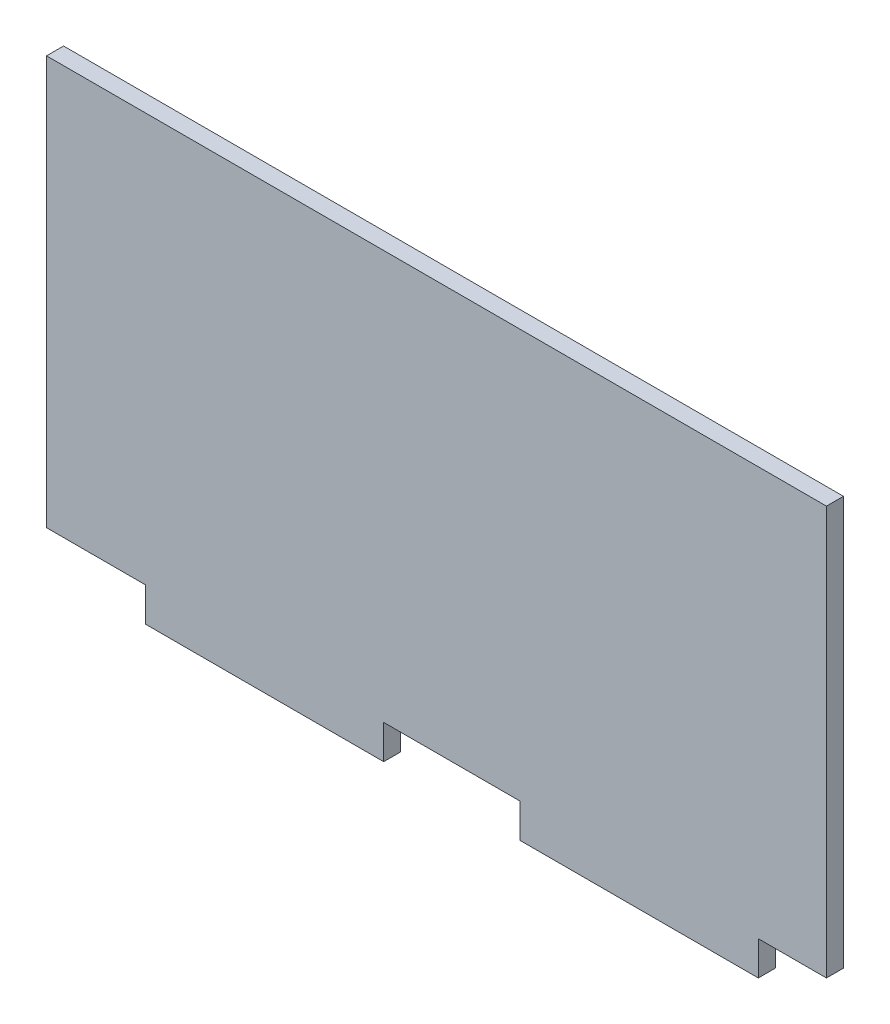
ISO-10303-21;
HEADER;
FILE_DESCRIPTION(('STEP AP214'),'2;1');
FILE_NAME('part.step','',(''),(''),'','','');
FILE_SCHEMA(('AUTOMOTIVE_DESIGN { 1 0 10303 214 1 1 1 1 }'));
ENDSEC;
DATA;
#1=APPLICATION_CONTEXT('core data for automotive mechanical design processes');
#2=APPLICATION_PROTOCOL_DEFINITION('international standard','automotive_design',2000,#1);
#3=PRODUCT_CONTEXT('',#1,'mechanical');
#4=PRODUCT('Part','Part','',(#3));
#5=PRODUCT_RELATED_PRODUCT_CATEGORY('part','',(#4));
#6=PRODUCT_DEFINITION_FORMATION('','',#4);
#7=PRODUCT_DEFINITION_CONTEXT('part definition',#1,'design');
#8=PRODUCT_DEFINITION('design','',#6,#7);
#9=PRODUCT_DEFINITION_SHAPE('','',#8);
#10=(LENGTH_UNIT() NAMED_UNIT(*) SI_UNIT(.MILLI.,.METRE.));
#11=(NAMED_UNIT(*) PLANE_ANGLE_UNIT() SI_UNIT($,.RADIAN.));
#12=(NAMED_UNIT(*) SI_UNIT($,.STERADIAN.) SOLID_ANGLE_UNIT());
#13=UNCERTAINTY_MEASURE_WITH_UNIT(LENGTH_MEASURE(1.E-05),#10,'distance_accuracy_value','');
#14=(GEOMETRIC_REPRESENTATION_CONTEXT(3) GLOBAL_UNCERTAINTY_ASSIGNED_CONTEXT((#13)) GLOBAL_UNIT_ASSIGNED_CONTEXT((#10,
#11,#12)) REPRESENTATION_CONTEXT('',''));
#15=CARTESIAN_POINT('',(0.,0.,0.));
#16=DIRECTION('',(0.,0.,1.));
#17=DIRECTION('',(1.,0.,0.));
#18=AXIS2_PLACEMENT_3D('',#15,#16,#17);
#19=CARTESIAN_POINT('',(144.376012965964,120.,5.));
#20=DIRECTION('',(0.,-1.,0.));
#21=DIRECTION('',(1.,0.,0.));
#22=AXIS2_PLACEMENT_3D('',#19,#20,#21);
#23=PLANE('',#22);
#24=DIRECTION('',(-1.,0.,0.));
#25=VECTOR('',#24,1.);
#26=CARTESIAN_POINT('',(144.376012965964,120.,0.));
#27=LINE('',#26,#25);
#28=CARTESIAN_POINT('',(144.376012965964,120.,0.));
#29=VERTEX_POINT('',#28);
#30=CARTESIAN_POINT('',(-84.6239870340357,120.,0.));
#31=VERTEX_POINT('',#30);
#32=EDGE_CURVE('E160',#29,#31,#27,.T.);
#33=ORIENTED_EDGE('',*,*,#32,.T.);
#34=DIRECTION('',(0.,0.,-1.));
#35=VECTOR('',#34,1.);
#36=CARTESIAN_POINT('',(-84.6239870340357,120.,5.));
#37=LINE('',#36,#35);
#38=CARTESIAN_POINT('',(-84.6239870340357,120.,5.));
#39=VERTEX_POINT('',#38);
#40=EDGE_CURVE('E11',#39,#31,#37,.T.);
#41=ORIENTED_EDGE('',*,*,#40,.F.);
#42=DIRECTION('',(-1.,0.,0.));
#43=VECTOR('',#42,1.);
#44=CARTESIAN_POINT('',(144.376012965964,120.,5.));
#45=LINE('',#44,#43);
#46=CARTESIAN_POINT('',(144.376012965964,120.,5.));
#47=VERTEX_POINT('',#46);
#48=EDGE_CURVE('E182',#47,#39,#45,.T.);
#49=ORIENTED_EDGE('',*,*,#48,.F.);
#50=DIRECTION('',(0.,0.,-1.));
#51=VECTOR('',#50,1.);
#52=CARTESIAN_POINT('',(144.376012965964,120.,5.));
#53=LINE('',#52,#51);
#54=EDGE_CURVE('E156',#47,#29,#53,.T.);
#55=ORIENTED_EDGE('',*,*,#54,.T.);
#56=EDGE_LOOP('',(#33,#41,#49,#55));
#57=FACE_BOUND('',#56,.T.);
#58=ADVANCED_FACE('F40',(#57),#23,.F.);
#59=CARTESIAN_POINT('',(-84.6239870340357,120.,5.));
#60=DIRECTION('',(1.,0.,0.));
#61=DIRECTION('',(0.,1.,0.));
#62=AXIS2_PLACEMENT_3D('',#59,#60,#61);
#63=PLANE('',#62);
#64=DIRECTION('',(0.,-1.,0.));
#65=VECTOR('',#64,1.);
#66=CARTESIAN_POINT('',(-84.6239870340357,120.,0.));
#67=LINE('',#66,#65);
#68=CARTESIAN_POINT('',(-84.6239870340357,0.,0.));
#69=VERTEX_POINT('',#68);
#70=EDGE_CURVE('E163',#31,#69,#67,.T.);
#71=ORIENTED_EDGE('',*,*,#70,.T.);
#72=DIRECTION('',(0.,0.,-1.));
#73=VECTOR('',#72,1.);
#74=CARTESIAN_POINT('',(-84.6239870340357,0.,5.));
#75=LINE('',#74,#73);
#76=CARTESIAN_POINT('',(-84.6239870340357,0.,5.));
#77=VERTEX_POINT('',#76);
#78=EDGE_CURVE('E48',#77,#69,#75,.T.);
#79=ORIENTED_EDGE('',*,*,#78,.F.);
#80=DIRECTION('',(0.,-1.,0.));
#81=VECTOR('',#80,1.);
#82=CARTESIAN_POINT('',(-84.6239870340357,120.,5.));
#83=LINE('',#82,#81);
#84=EDGE_CURVE('E111',#39,#77,#83,.T.);
#85=ORIENTED_EDGE('',*,*,#84,.F.);
#86=ORIENTED_EDGE('',*,*,#40,.T.);
#87=EDGE_LOOP('',(#71,#79,#85,#86));
#88=FACE_BOUND('',#87,.T.);
#89=ADVANCED_FACE('F260',(#88),#63,.F.);
#90=CARTESIAN_POINT('',(-84.6239870340357,0.,5.));
#91=DIRECTION('',(0.,1.,0.));
#92=DIRECTION('',(0.,0.,1.));
#93=AXIS2_PLACEMENT_3D('',#90,#91,#92);
#94=PLANE('',#93);
#95=DIRECTION('',(1.,0.,0.));
#96=VECTOR('',#95,1.);
#97=CARTESIAN_POINT('',(-84.6239870340357,0.,0.));
#98=LINE('',#97,#96);
#99=CARTESIAN_POINT('',(-55.6239870340357,0.,0.));
#100=VERTEX_POINT('',#99);
#101=EDGE_CURVE('E165',#69,#100,#98,.T.);
#102=ORIENTED_EDGE('',*,*,#101,.T.);
#103=DIRECTION('',(0.,0.,-1.));
#104=VECTOR('',#103,1.);
#105=CARTESIAN_POINT('',(-55.6239870340357,0.,5.));
#106=LINE('',#105,#104);
#107=CARTESIAN_POINT('',(-55.6239870340357,0.,5.));
#108=VERTEX_POINT('',#107);
#109=EDGE_CURVE('E201',#108,#100,#106,.T.);
#110=ORIENTED_EDGE('',*,*,#109,.F.);
#111=DIRECTION('',(1.,0.,0.));
#112=VECTOR('',#111,1.);
#113=CARTESIAN_POINT('',(-84.6239870340357,0.,5.));
#114=LINE('',#113,#112);
#115=EDGE_CURVE('E209',#77,#108,#114,.T.);
#116=ORIENTED_EDGE('',*,*,#115,.F.);
#117=ORIENTED_EDGE('',*,*,#78,.T.);
#118=EDGE_LOOP('',(#102,#110,#116,#117));
#119=FACE_BOUND('',#118,.T.);
#120=ADVANCED_FACE('F207',(#119),#94,.F.);
#121=CARTESIAN_POINT('',(-55.6239870340357,0.,5.));
#122=DIRECTION('',(1.,0.,0.));
#123=DIRECTION('',(0.,0.,-1.));
#124=AXIS2_PLACEMENT_3D('',#121,#122,#123);
#125=PLANE('',#124);
#126=DIRECTION('',(0.,-1.,0.));
#127=VECTOR('',#126,1.);
#128=CARTESIAN_POINT('',(-55.6239870340357,0.,0.));
#129=LINE('',#128,#127);
#130=CARTESIAN_POINT('',(-55.6239870340357,-10.,0.));
#131=VERTEX_POINT('',#130);
#132=EDGE_CURVE('E167',#100,#131,#129,.T.);
#133=ORIENTED_EDGE('',*,*,#132,.T.);
#134=DIRECTION('',(0.,0.,-1.));
#135=VECTOR('',#134,1.);
#136=CARTESIAN_POINT('',(-55.6239870340357,-10.,5.));
#137=LINE('',#136,#135);
#138=CARTESIAN_POINT('',(-55.6239870340357,-10.,5.));
#139=VERTEX_POINT('',#138);
#140=EDGE_CURVE('E198',#139,#131,#137,.T.);
#141=ORIENTED_EDGE('',*,*,#140,.F.);
#142=DIRECTION('',(0.,-1.,0.));
#143=VECTOR('',#142,1.);
#144=CARTESIAN_POINT('',(-55.6239870340357,0.,5.));
#145=LINE('',#144,#143);
#146=EDGE_CURVE('E227',#108,#139,#145,.T.);
#147=ORIENTED_EDGE('',*,*,#146,.F.);
#148=ORIENTED_EDGE('',*,*,#109,.T.);
#149=EDGE_LOOP('',(#133,#141,#147,#148));
#150=FACE_BOUND('',#149,.T.);
#151=ADVANCED_FACE('F218',(#150),#125,.F.);
#152=CARTESIAN_POINT('',(-55.6239870340357,-10.,5.));
#153=DIRECTION('',(0.,1.,0.));
#154=DIRECTION('',(0.,0.,1.));
#155=AXIS2_PLACEMENT_3D('',#152,#153,#154);
#156=PLANE('',#155);
#157=DIRECTION('',(1.,0.,0.));
#158=VECTOR('',#157,1.);
#159=CARTESIAN_POINT('',(-55.6239870340357,-10.,0.));
#160=LINE('',#159,#158);
#161=CARTESIAN_POINT('',(14.3760129659643,-10.,0.));
#162=VERTEX_POINT('',#161);
#163=EDGE_CURVE('E169',#131,#162,#160,.T.);
#164=ORIENTED_EDGE('',*,*,#163,.T.);
#165=DIRECTION('',(0.,0.,-1.));
#166=VECTOR('',#165,1.);
#167=CARTESIAN_POINT('',(14.3760129659643,-10.,5.));
#168=LINE('',#167,#166);
#169=CARTESIAN_POINT('',(14.3760129659643,-10.,5.));
#170=VERTEX_POINT('',#169);
#171=EDGE_CURVE('E195',#170,#162,#168,.T.);
#172=ORIENTED_EDGE('',*,*,#171,.F.);
#173=DIRECTION('',(1.,0.,0.));
#174=VECTOR('',#173,1.);
#175=CARTESIAN_POINT('',(-55.6239870340357,-10.,5.));
#176=LINE('',#175,#174);
#177=EDGE_CURVE('E224',#139,#170,#176,.T.);
#178=ORIENTED_EDGE('',*,*,#177,.F.);
#179=ORIENTED_EDGE('',*,*,#140,.T.);
#180=EDGE_LOOP('',(#164,#172,#178,#179));
#181=FACE_BOUND('',#180,.T.);
#182=ADVANCED_FACE('F222',(#181),#156,.F.);
#183=CARTESIAN_POINT('',(14.3760129659643,-10.,5.));
#184=DIRECTION('',(-1.,0.,0.));
#185=DIRECTION('',(0.,0.,1.));
#186=AXIS2_PLACEMENT_3D('',#183,#184,#185);
#187=PLANE('',#186);
#188=DIRECTION('',(0.,1.,0.));
#189=VECTOR('',#188,1.);
#190=CARTESIAN_POINT('',(14.3760129659643,-10.,0.));
#191=LINE('',#190,#189);
#192=CARTESIAN_POINT('',(14.3760129659643,0.,0.));
#193=VERTEX_POINT('',#192);
#194=EDGE_CURVE('E171',#162,#193,#191,.T.);
#195=ORIENTED_EDGE('',*,*,#194,.T.);
#196=DIRECTION('',(0.,0.,-1.));
#197=VECTOR('',#196,1.);
#198=CARTESIAN_POINT('',(14.3760129659643,0.,5.));
#199=LINE('',#198,#197);
#200=CARTESIAN_POINT('',(14.3760129659643,0.,5.));
#201=VERTEX_POINT('',#200);
#202=EDGE_CURVE('E192',#201,#193,#199,.T.);
#203=ORIENTED_EDGE('',*,*,#202,.F.);
#204=DIRECTION('',(0.,1.,0.));
#205=VECTOR('',#204,1.);
#206=CARTESIAN_POINT('',(14.3760129659643,-10.,5.));
#207=LINE('',#206,#205);
#208=EDGE_CURVE('E226',#170,#201,#207,.T.);
#209=ORIENTED_EDGE('',*,*,#208,.F.);
#210=ORIENTED_EDGE('',*,*,#171,.T.);
#211=EDGE_LOOP('',(#195,#203,#209,#210));
#212=FACE_BOUND('',#211,.T.);
#213=ADVANCED_FACE('F273',(#212),#187,.F.);
#214=CARTESIAN_POINT('',(14.3760129659643,0.,5.));
#215=DIRECTION('',(0.,1.,0.));
#216=DIRECTION('',(0.,0.,1.));
#217=AXIS2_PLACEMENT_3D('',#214,#215,#216);
#218=PLANE('',#217);
#219=DIRECTION('',(1.,0.,0.));
#220=VECTOR('',#219,1.);
#221=CARTESIAN_POINT('',(14.3760129659643,0.,0.));
#222=LINE('',#221,#220);
#223=CARTESIAN_POINT('',(54.3760129659643,0.,0.));
#224=VERTEX_POINT('',#223);
#225=EDGE_CURVE('E173',#193,#224,#222,.T.);
#226=ORIENTED_EDGE('',*,*,#225,.T.);
#227=DIRECTION('',(0.,0.,-1.));
#228=VECTOR('',#227,1.);
#229=CARTESIAN_POINT('',(54.3760129659643,0.,5.));
#230=LINE('',#229,#228);
#231=CARTESIAN_POINT('',(54.3760129659643,0.,5.));
#232=VERTEX_POINT('',#231);
#233=EDGE_CURVE('E189',#232,#224,#230,.T.);
#234=ORIENTED_EDGE('',*,*,#233,.F.);
#235=DIRECTION('',(1.,0.,0.));
#236=VECTOR('',#235,1.);
#237=CARTESIAN_POINT('',(14.3760129659643,0.,5.));
#238=LINE('',#237,#236);
#239=EDGE_CURVE('E229',#201,#232,#238,.T.);
#240=ORIENTED_EDGE('',*,*,#239,.F.);
#241=ORIENTED_EDGE('',*,*,#202,.T.);
#242=EDGE_LOOP('',(#226,#234,#240,#241));
#243=FACE_BOUND('',#242,.T.);
#244=ADVANCED_FACE('F276',(#243),#218,.F.);
#245=CARTESIAN_POINT('',(54.3760129659643,0.,5.));
#246=DIRECTION('',(1.,0.,0.));
#247=DIRECTION('',(0.,0.,-1.));
#248=AXIS2_PLACEMENT_3D('',#245,#246,#247);
#249=PLANE('',#248);
#250=DIRECTION('',(0.,-1.,0.));
#251=VECTOR('',#250,1.);
#252=CARTESIAN_POINT('',(54.3760129659643,0.,0.));
#253=LINE('',#252,#251);
#254=CARTESIAN_POINT('',(54.3760129659643,-10.,0.));
#255=VERTEX_POINT('',#254);
#256=EDGE_CURVE('E175',#224,#255,#253,.T.);
#257=ORIENTED_EDGE('',*,*,#256,.T.);
#258=DIRECTION('',(0.,0.,-1.));
#259=VECTOR('',#258,1.);
#260=CARTESIAN_POINT('',(54.3760129659643,-10.,5.));
#261=LINE('',#260,#259);
#262=CARTESIAN_POINT('',(54.3760129659643,-10.,5.));
#263=VERTEX_POINT('',#262);
#264=EDGE_CURVE('E186',#263,#255,#261,.T.);
#265=ORIENTED_EDGE('',*,*,#264,.F.);
#266=DIRECTION('',(0.,-1.,0.));
#267=VECTOR('',#266,1.);
#268=CARTESIAN_POINT('',(54.3760129659643,0.,5.));
#269=LINE('',#268,#267);
#270=EDGE_CURVE('E235',#232,#263,#269,.T.);
#271=ORIENTED_EDGE('',*,*,#270,.F.);
#272=ORIENTED_EDGE('',*,*,#233,.T.);
#273=EDGE_LOOP('',(#257,#265,#271,#272));
#274=FACE_BOUND('',#273,.T.);
#275=ADVANCED_FACE('F241',(#274),#249,.F.);
#276=CARTESIAN_POINT('',(54.3760129659643,-10.,5.));
#277=DIRECTION('',(0.,1.,0.));
#278=DIRECTION('',(0.,0.,1.));
#279=AXIS2_PLACEMENT_3D('',#276,#277,#278);
#280=PLANE('',#279);
#281=DIRECTION('',(1.,0.,0.));
#282=VECTOR('',#281,1.);
#283=CARTESIAN_POINT('',(54.3760129659643,-10.,0.));
#284=LINE('',#283,#282);
#285=CARTESIAN_POINT('',(124.376012965964,-10.,0.));
#286=VERTEX_POINT('',#285);
#287=EDGE_CURVE('E177',#255,#286,#284,.T.);
#288=ORIENTED_EDGE('',*,*,#287,.T.);
#289=DIRECTION('',(0.,0.,-1.));
#290=VECTOR('',#289,1.);
#291=CARTESIAN_POINT('',(124.376012965964,-10.,5.));
#292=LINE('',#291,#290);
#293=CARTESIAN_POINT('',(124.376012965964,-10.,5.));
#294=VERTEX_POINT('',#293);
#295=EDGE_CURVE('E151',#294,#286,#292,.T.);
#296=ORIENTED_EDGE('',*,*,#295,.F.);
#297=DIRECTION('',(1.,0.,0.));
#298=VECTOR('',#297,1.);
#299=CARTESIAN_POINT('',(54.3760129659643,-10.,5.));
#300=LINE('',#299,#298);
#301=EDGE_CURVE('E142',#263,#294,#300,.T.);
#302=ORIENTED_EDGE('',*,*,#301,.F.);
#303=ORIENTED_EDGE('',*,*,#264,.T.);
#304=EDGE_LOOP('',(#288,#296,#302,#303));
#305=FACE_BOUND('',#304,.T.);
#306=ADVANCED_FACE('F245',(#305),#280,.F.);
#307=CARTESIAN_POINT('',(124.376012965964,-10.,5.));
#308=DIRECTION('',(-1.,0.,0.));
#309=DIRECTION('',(0.,0.,1.));
#310=AXIS2_PLACEMENT_3D('',#307,#308,#309);
#311=PLANE('',#310);
#312=DIRECTION('',(0.,1.,0.));
#313=VECTOR('',#312,1.);
#314=CARTESIAN_POINT('',(124.376012965964,-10.,0.));
#315=LINE('',#314,#313);
#316=CARTESIAN_POINT('',(124.376012965964,0.,0.));
#317=VERTEX_POINT('',#316);
#318=EDGE_CURVE('E150',#286,#317,#315,.T.);
#319=ORIENTED_EDGE('',*,*,#318,.T.);
#320=DIRECTION('',(0.,0.,-1.));
#321=VECTOR('',#320,1.);
#322=CARTESIAN_POINT('',(124.376012965964,0.,5.));
#323=LINE('',#322,#321);
#324=CARTESIAN_POINT('',(124.376012965964,0.,5.));
#325=VERTEX_POINT('',#324);
#326=EDGE_CURVE('E147',#325,#317,#323,.T.);
#327=ORIENTED_EDGE('',*,*,#326,.F.);
#328=DIRECTION('',(0.,1.,0.));
#329=VECTOR('',#328,1.);
#330=CARTESIAN_POINT('',(124.376012965964,-10.,5.));
#331=LINE('',#330,#329);
#332=EDGE_CURVE('E136',#294,#325,#331,.T.);
#333=ORIENTED_EDGE('',*,*,#332,.F.);
#334=ORIENTED_EDGE('',*,*,#295,.T.);
#335=EDGE_LOOP('',(#319,#327,#333,#334));
#336=FACE_BOUND('',#335,.T.);
#337=ADVANCED_FACE('F148',(#336),#311,.F.);
#338=CARTESIAN_POINT('',(124.376012965964,0.,5.));
#339=DIRECTION('',(0.,1.,0.));
#340=DIRECTION('',(0.,0.,1.));
#341=AXIS2_PLACEMENT_3D('',#338,#339,#340);
#342=PLANE('',#341);
#343=DIRECTION('',(1.,0.,0.));
#344=VECTOR('',#343,1.);
#345=CARTESIAN_POINT('',(124.376012965964,0.,0.));
#346=LINE('',#345,#344);
#347=CARTESIAN_POINT('',(144.376012965964,0.,0.));
#348=VERTEX_POINT('',#347);
#349=EDGE_CURVE('E97',#317,#348,#346,.T.);
#350=ORIENTED_EDGE('',*,*,#349,.T.);
#351=DIRECTION('',(0.,0.,-1.));
#352=VECTOR('',#351,1.);
#353=CARTESIAN_POINT('',(144.376012965964,0.,5.));
#354=LINE('',#353,#352);
#355=CARTESIAN_POINT('',(144.376012965964,0.,5.));
#356=VERTEX_POINT('',#355);
#357=EDGE_CURVE('E152',#356,#348,#354,.T.);
#358=ORIENTED_EDGE('',*,*,#357,.F.);
#359=DIRECTION('',(1.,0.,0.));
#360=VECTOR('',#359,1.);
#361=CARTESIAN_POINT('',(124.376012965964,0.,5.));
#362=LINE('',#361,#360);
#363=EDGE_CURVE('E140',#325,#356,#362,.T.);
#364=ORIENTED_EDGE('',*,*,#363,.F.);
#365=ORIENTED_EDGE('',*,*,#326,.T.);
#366=EDGE_LOOP('',(#350,#358,#364,#365));
#367=FACE_BOUND('',#366,.T.);
#368=ADVANCED_FACE('F154',(#367),#342,.F.);
#369=CARTESIAN_POINT('',(144.376012965964,0.,5.));
#370=DIRECTION('',(-1.,0.,0.));
#371=DIRECTION('',(0.,0.,1.));
#372=AXIS2_PLACEMENT_3D('',#369,#370,#371);
#373=PLANE('',#372);
#374=DIRECTION('',(0.,1.,0.));
#375=VECTOR('',#374,1.);
#376=CARTESIAN_POINT('',(144.376012965964,0.,0.));
#377=LINE('',#376,#375);
#378=EDGE_CURVE('E103',#348,#29,#377,.T.);
#379=ORIENTED_EDGE('',*,*,#378,.T.);
#380=ORIENTED_EDGE('',*,*,#54,.F.);
#381=DIRECTION('',(0.,1.,0.));
#382=VECTOR('',#381,1.);
#383=CARTESIAN_POINT('',(144.376012965964,0.,5.));
#384=LINE('',#383,#382);
#385=EDGE_CURVE('E56',#356,#47,#384,.T.);
#386=ORIENTED_EDGE('',*,*,#385,.F.);
#387=ORIENTED_EDGE('',*,*,#357,.T.);
#388=EDGE_LOOP('',(#379,#380,#386,#387));
#389=FACE_BOUND('',#388,.T.);
#390=ADVANCED_FACE('F249',(#389),#373,.F.);
#391=CARTESIAN_POINT('',(0.,0.,5.));
#392=DIRECTION('',(0.,0.,1.));
#393=DIRECTION('',(1.,0.,0.));
#394=AXIS2_PLACEMENT_3D('',#391,#392,#393);
#395=PLANE('',#394);
#396=ORIENTED_EDGE('',*,*,#48,.T.);
#397=ORIENTED_EDGE('',*,*,#84,.T.);
#398=ORIENTED_EDGE('',*,*,#115,.T.);
#399=ORIENTED_EDGE('',*,*,#146,.T.);
#400=ORIENTED_EDGE('',*,*,#177,.T.);
#401=ORIENTED_EDGE('',*,*,#208,.T.);
#402=ORIENTED_EDGE('',*,*,#239,.T.);
#403=ORIENTED_EDGE('',*,*,#270,.T.);
#404=ORIENTED_EDGE('',*,*,#301,.T.);
#405=ORIENTED_EDGE('',*,*,#332,.T.);
#406=ORIENTED_EDGE('',*,*,#363,.T.);
#407=ORIENTED_EDGE('',*,*,#385,.T.);
#408=EDGE_LOOP('',(#396,#397,#398,#399,#400,#401,#402,#403,#404,#405,#406,#407));
#409=FACE_BOUND('',#408,.T.);
#410=ADVANCED_FACE('F138',(#409),#395,.T.);
#411=CARTESIAN_POINT('',(0.,0.,0.));
#412=DIRECTION('',(0.,0.,1.));
#413=DIRECTION('',(1.,0.,0.));
#414=AXIS2_PLACEMENT_3D('',#411,#412,#413);
#415=PLANE('',#414);
#416=ORIENTED_EDGE('',*,*,#32,.F.);
#417=ORIENTED_EDGE('',*,*,#378,.F.);
#418=ORIENTED_EDGE('',*,*,#349,.F.);
#419=ORIENTED_EDGE('',*,*,#318,.F.);
#420=ORIENTED_EDGE('',*,*,#287,.F.);
#421=ORIENTED_EDGE('',*,*,#256,.F.);
#422=ORIENTED_EDGE('',*,*,#225,.F.);
#423=ORIENTED_EDGE('',*,*,#194,.F.);
#424=ORIENTED_EDGE('',*,*,#163,.F.);
#425=ORIENTED_EDGE('',*,*,#132,.F.);
#426=ORIENTED_EDGE('',*,*,#101,.F.);
#427=ORIENTED_EDGE('',*,*,#70,.F.);
#428=EDGE_LOOP('',(#416,#417,#418,#419,#420,#421,#422,#423,#424,#425,#426,#427));
#429=FACE_BOUND('',#428,.T.);
#430=ADVANCED_FACE('F213',(#429),#415,.F.);
#431=CLOSED_SHELL('',(#58,#89,#120,#151,#182,#213,#244,#275,#306,#337,#368,#390,#410,#430));
#432=MANIFOLD_SOLID_BREP('B2',#431);
#433=ADVANCED_BREP_SHAPE_REPRESENTATION('',(#18,#432),#14);
#434=SHAPE_DEFINITION_REPRESENTATION(#9,#433);
ENDSEC;
END-ISO-10303-21;
